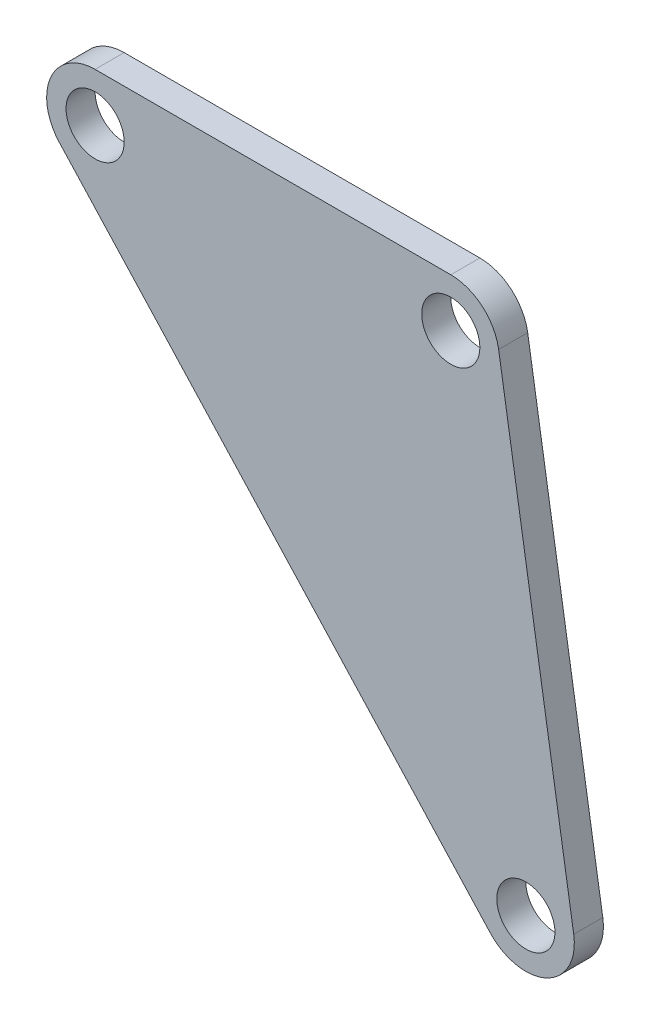
ISO-10303-21;
HEADER;
FILE_DESCRIPTION(('STEP AP214'),'2;1');
FILE_NAME('part.step','',(''),(''),'','','');
FILE_SCHEMA(('AUTOMOTIVE_DESIGN { 1 0 10303 214 1 1 1 1 }'));
ENDSEC;
DATA;
#1=APPLICATION_CONTEXT('core data for automotive mechanical design processes');
#2=APPLICATION_PROTOCOL_DEFINITION('international standard','automotive_design',2000,#1);
#3=PRODUCT_CONTEXT('',#1,'mechanical');
#4=PRODUCT('Part','Part','',(#3));
#5=PRODUCT_RELATED_PRODUCT_CATEGORY('part','',(#4));
#6=PRODUCT_DEFINITION_FORMATION('','',#4);
#7=PRODUCT_DEFINITION_CONTEXT('part definition',#1,'design');
#8=PRODUCT_DEFINITION('design','',#6,#7);
#9=PRODUCT_DEFINITION_SHAPE('','',#8);
#10=(LENGTH_UNIT() NAMED_UNIT(*) SI_UNIT(.MILLI.,.METRE.));
#11=(NAMED_UNIT(*) PLANE_ANGLE_UNIT() SI_UNIT($,.RADIAN.));
#12=(NAMED_UNIT(*) SI_UNIT($,.STERADIAN.) SOLID_ANGLE_UNIT());
#13=UNCERTAINTY_MEASURE_WITH_UNIT(LENGTH_MEASURE(1.E-05),#10,'distance_accuracy_value','');
#14=(GEOMETRIC_REPRESENTATION_CONTEXT(3) GLOBAL_UNCERTAINTY_ASSIGNED_CONTEXT((#13)) GLOBAL_UNIT_ASSIGNED_CONTEXT((#10,
#11,#12)) REPRESENTATION_CONTEXT('',''));
#15=CARTESIAN_POINT('',(0.,0.,0.));
#16=DIRECTION('',(0.,0.,1.));
#17=DIRECTION('',(1.,0.,0.));
#18=AXIS2_PLACEMENT_3D('',#15,#16,#17);
#19=CARTESIAN_POINT('',(0.,0.,3.));
#20=DIRECTION('',(0.,0.,-1.));
#21=DIRECTION('',(-1.,0.,0.));
#22=AXIS2_PLACEMENT_3D('',#19,#20,#21);
#23=PLANE('',#22);
#24=DIRECTION('',(0.67650828014383,-0.736435025577164,0.));
#25=VECTOR('',#24,1.);
#26=CARTESIAN_POINT('',(-48.0825946751372,4.99999999999999,3.));
#27=LINE('',#26,#25);
#28=CARTESIAN_POINT('',(-40.3821751278858,-3.38254140071916,3.));
#29=VERTEX_POINT('',#28);
#30=CARTESIAN_POINT('',(4.06441887756376,-51.7663225811388,3.));
#31=VERTEX_POINT('',#30);
#32=EDGE_CURVE('E114',#29,#31,#27,.T.);
#33=ORIENTED_EDGE('',*,*,#32,.T.);
#34=CARTESIAN_POINT('',(7.74659400544958,-48.3837811804196,3.));
#35=DIRECTION('',(0.,0.,-1.));
#36=DIRECTION('',(-1.,0.,0.));
#37=AXIS2_PLACEMENT_3D('',#34,#35,#36);
#38=CIRCLE('',#37,5.);
#39=CARTESIAN_POINT('',(12.6837145340638,-47.5933124043533,3.));
#40=VERTEX_POINT('',#39);
#41=EDGE_CURVE('E129',#31,#40,#38,.F.);
#42=ORIENTED_EDGE('',*,*,#41,.T.);
#43=DIRECTION('',(-0.158093755213257,0.98742410572285,0.));
#44=VECTOR('',#43,1.);
#45=CARTESIAN_POINT('',(15.3122227106276,-64.0104841776948,3.));
#46=LINE('',#45,#44);
#47=CARTESIAN_POINT('',(4.93712052861423,0.790468776066297,3.));
#48=VERTEX_POINT('',#47);
#49=EDGE_CURVE('E104',#40,#48,#46,.T.);
#50=ORIENTED_EDGE('',*,*,#49,.T.);
#51=CARTESIAN_POINT('',(0.,0.,3.));
#52=DIRECTION('',(0.,0.,-1.));
#53=DIRECTION('',(-1.,0.,0.));
#54=AXIS2_PLACEMENT_3D('',#51,#52,#53);
#55=CIRCLE('',#54,5.);
#56=CARTESIAN_POINT('',(0.,5.,3.));
#57=VERTEX_POINT('',#56);
#58=EDGE_CURVE('E52',#48,#57,#55,.F.);
#59=ORIENTED_EDGE('',*,*,#58,.T.);
#60=DIRECTION('',(-1.,0.,0.));
#61=VECTOR('',#60,1.);
#62=CARTESIAN_POINT('',(4.26314407308507,5.,3.));
#63=LINE('',#62,#61);
#64=CARTESIAN_POINT('',(-36.7,4.99999999999999,3.));
#65=VERTEX_POINT('',#64);
#66=EDGE_CURVE('E111',#57,#65,#63,.T.);
#67=ORIENTED_EDGE('',*,*,#66,.T.);
#68=CARTESIAN_POINT('',(-36.7,0.,3.));
#69=DIRECTION('',(0.,0.,-1.));
#70=DIRECTION('',(-1.,0.,0.));
#71=AXIS2_PLACEMENT_3D('',#68,#69,#70);
#72=CIRCLE('',#71,5.);
#73=EDGE_CURVE('E127',#65,#29,#72,.F.);
#74=ORIENTED_EDGE('',*,*,#73,.T.);
#75=EDGE_LOOP('',(#33,#42,#50,#59,#67,#74));
#76=FACE_BOUND('',#75,.T.);
#77=CARTESIAN_POINT('',(-36.7,0.,3.));
#78=DIRECTION('',(0.,0.,1.));
#79=DIRECTION('',(1.,0.,0.));
#80=AXIS2_PLACEMENT_3D('',#77,#78,#79);
#81=CIRCLE('',#80,3.00000000000001);
#82=CARTESIAN_POINT('',(-33.7,0.,3.));
#83=VERTEX_POINT('',#82);
#84=EDGE_CURVE('E134',#83,#83,#81,.T.);
#85=ORIENTED_EDGE('',*,*,#84,.F.);
#86=EDGE_LOOP('',(#85));
#87=FACE_BOUND('',#86,.T.);
#88=CARTESIAN_POINT('',(0.,0.,3.));
#89=DIRECTION('',(0.,0.,1.));
#90=DIRECTION('',(1.,0.,0.));
#91=AXIS2_PLACEMENT_3D('',#88,#89,#90);
#92=CIRCLE('',#91,3.);
#93=CARTESIAN_POINT('',(3.,0.,3.));
#94=VERTEX_POINT('',#93);
#95=EDGE_CURVE('E143',#94,#94,#92,.T.);
#96=ORIENTED_EDGE('',*,*,#95,.F.);
#97=EDGE_LOOP('',(#96));
#98=FACE_BOUND('',#97,.T.);
#99=CARTESIAN_POINT('',(7.74659400544959,-48.3837811804197,3.));
#100=DIRECTION('',(0.,0.,1.));
#101=DIRECTION('',(1.,0.,0.));
#102=AXIS2_PLACEMENT_3D('',#99,#100,#101);
#103=CIRCLE('',#102,3.);
#104=CARTESIAN_POINT('',(10.7465940054496,-48.3837811804197,3.));
#105=VERTEX_POINT('',#104);
#106=EDGE_CURVE('E148',#105,#105,#103,.T.);
#107=ORIENTED_EDGE('',*,*,#106,.F.);
#108=EDGE_LOOP('',(#107));
#109=FACE_BOUND('',#108,.T.);
#110=ADVANCED_FACE('F32',(#76,#87,#98,#109),#23,.F.);
#111=CARTESIAN_POINT('',(0.,0.,0.));
#112=DIRECTION('',(0.,0.,-1.));
#113=DIRECTION('',(-1.,0.,0.));
#114=AXIS2_PLACEMENT_3D('',#111,#112,#113);
#115=PLANE('',#114);
#116=CARTESIAN_POINT('',(0.,0.,0.));
#117=DIRECTION('',(0.,0.,1.));
#118=DIRECTION('',(1.,0.,0.));
#119=AXIS2_PLACEMENT_3D('',#116,#117,#118);
#120=CIRCLE('',#119,3.);
#121=CARTESIAN_POINT('',(3.,0.,0.));
#122=VERTEX_POINT('',#121);
#123=EDGE_CURVE('E145',#122,#122,#120,.T.);
#124=ORIENTED_EDGE('',*,*,#123,.T.);
#125=EDGE_LOOP('',(#124));
#126=FACE_BOUND('',#125,.T.);
#127=DIRECTION('',(-0.158093755213257,0.98742410572285,0.));
#128=VECTOR('',#127,1.);
#129=CARTESIAN_POINT('',(15.3122227106276,-64.0104841776948,0.));
#130=LINE('',#129,#128);
#131=CARTESIAN_POINT('',(12.6837145340638,-47.5933124043533,0.));
#132=VERTEX_POINT('',#131);
#133=CARTESIAN_POINT('',(4.93712052861423,0.790468776066297,0.));
#134=VERTEX_POINT('',#133);
#135=EDGE_CURVE('E102',#132,#134,#130,.T.);
#136=ORIENTED_EDGE('',*,*,#135,.F.);
#137=CARTESIAN_POINT('',(7.74659400544958,-48.3837811804196,0.));
#138=DIRECTION('',(0.,0.,-1.));
#139=DIRECTION('',(-1.,0.,0.));
#140=AXIS2_PLACEMENT_3D('',#137,#138,#139);
#141=CIRCLE('',#140,5.);
#142=CARTESIAN_POINT('',(4.06441887756376,-51.7663225811388,0.));
#143=VERTEX_POINT('',#142);
#144=EDGE_CURVE('E85',#132,#143,#141,.T.);
#145=ORIENTED_EDGE('',*,*,#144,.T.);
#146=DIRECTION('',(0.67650828014383,-0.736435025577164,0.));
#147=VECTOR('',#146,1.);
#148=CARTESIAN_POINT('',(-48.0825946751372,4.99999999999999,0.));
#149=LINE('',#148,#147);
#150=CARTESIAN_POINT('',(-40.3821751278858,-3.38254140071916,0.));
#151=VERTEX_POINT('',#150);
#152=EDGE_CURVE('E112',#151,#143,#149,.T.);
#153=ORIENTED_EDGE('',*,*,#152,.F.);
#154=CARTESIAN_POINT('',(-36.7,0.,0.));
#155=DIRECTION('',(0.,0.,-1.));
#156=DIRECTION('',(-1.,0.,0.));
#157=AXIS2_PLACEMENT_3D('',#154,#155,#156);
#158=CIRCLE('',#157,5.);
#159=CARTESIAN_POINT('',(-36.7,4.99999999999999,0.));
#160=VERTEX_POINT('',#159);
#161=EDGE_CURVE('E96',#151,#160,#158,.T.);
#162=ORIENTED_EDGE('',*,*,#161,.T.);
#163=DIRECTION('',(-1.,0.,0.));
#164=VECTOR('',#163,1.);
#165=CARTESIAN_POINT('',(4.26314407308507,5.,0.));
#166=LINE('',#165,#164);
#167=CARTESIAN_POINT('',(0.,5.,0.));
#168=VERTEX_POINT('',#167);
#169=EDGE_CURVE('E116',#168,#160,#166,.T.);
#170=ORIENTED_EDGE('',*,*,#169,.F.);
#171=CARTESIAN_POINT('',(0.,0.,0.));
#172=DIRECTION('',(0.,0.,-1.));
#173=DIRECTION('',(-1.,0.,0.));
#174=AXIS2_PLACEMENT_3D('',#171,#172,#173);
#175=CIRCLE('',#174,5.);
#176=EDGE_CURVE('E105',#168,#134,#175,.T.);
#177=ORIENTED_EDGE('',*,*,#176,.T.);
#178=EDGE_LOOP('',(#136,#145,#153,#162,#170,#177));
#179=FACE_BOUND('',#178,.T.);
#180=CARTESIAN_POINT('',(-36.7,0.,0.));
#181=DIRECTION('',(0.,0.,1.));
#182=DIRECTION('',(1.,0.,0.));
#183=AXIS2_PLACEMENT_3D('',#180,#181,#182);
#184=CIRCLE('',#183,3.00000000000001);
#185=CARTESIAN_POINT('',(-33.7,0.,0.));
#186=VERTEX_POINT('',#185);
#187=EDGE_CURVE('E136',#186,#186,#184,.T.);
#188=ORIENTED_EDGE('',*,*,#187,.T.);
#189=EDGE_LOOP('',(#188));
#190=FACE_BOUND('',#189,.T.);
#191=CARTESIAN_POINT('',(7.74659400544959,-48.3837811804197,0.));
#192=DIRECTION('',(0.,0.,1.));
#193=DIRECTION('',(1.,0.,0.));
#194=AXIS2_PLACEMENT_3D('',#191,#192,#193);
#195=CIRCLE('',#194,3.);
#196=CARTESIAN_POINT('',(10.7465940054496,-48.3837811804197,0.));
#197=VERTEX_POINT('',#196);
#198=EDGE_CURVE('E151',#197,#197,#195,.T.);
#199=ORIENTED_EDGE('',*,*,#198,.T.);
#200=EDGE_LOOP('',(#199));
#201=FACE_BOUND('',#200,.T.);
#202=ADVANCED_FACE('F108',(#126,#179,#190,#201),#115,.T.);
#203=CARTESIAN_POINT('',(4.26314407308507,5.,3.));
#204=DIRECTION('',(0.,-1.,0.));
#205=DIRECTION('',(1.,0.,0.));
#206=AXIS2_PLACEMENT_3D('',#203,#204,#205);
#207=PLANE('',#206);
#208=ORIENTED_EDGE('',*,*,#169,.T.);
#209=DIRECTION('',(0.,0.,-1.));
#210=VECTOR('',#209,1.);
#211=CARTESIAN_POINT('',(-36.7,4.99999999999999,3.));
#212=LINE('',#211,#210);
#213=EDGE_CURVE('E11',#160,#65,#212,.F.);
#214=ORIENTED_EDGE('',*,*,#213,.T.);
#215=ORIENTED_EDGE('',*,*,#66,.F.);
#216=DIRECTION('',(0.,0.,-1.));
#217=VECTOR('',#216,1.);
#218=CARTESIAN_POINT('',(0.,5.,3.));
#219=LINE('',#218,#217);
#220=EDGE_CURVE('E40',#57,#168,#219,.T.);
#221=ORIENTED_EDGE('',*,*,#220,.T.);
#222=EDGE_LOOP('',(#208,#214,#215,#221));
#223=FACE_BOUND('',#222,.T.);
#224=ADVANCED_FACE('F132',(#223),#207,.F.);
#225=CARTESIAN_POINT('',(-48.0825946751372,4.99999999999999,3.));
#226=DIRECTION('',(0.736435025577164,0.67650828014383,0.));
#227=DIRECTION('',(-0.67650828014383,0.736435025577164,0.));
#228=AXIS2_PLACEMENT_3D('',#225,#226,#227);
#229=PLANE('',#228);
#230=ORIENTED_EDGE('',*,*,#152,.T.);
#231=DIRECTION('',(0.,0.,-1.));
#232=VECTOR('',#231,1.);
#233=CARTESIAN_POINT('',(4.06441887756376,-51.7663225811388,3.));
#234=LINE('',#233,#232);
#235=EDGE_CURVE('E90',#143,#31,#234,.F.);
#236=ORIENTED_EDGE('',*,*,#235,.T.);
#237=ORIENTED_EDGE('',*,*,#32,.F.);
#238=DIRECTION('',(0.,0.,-1.));
#239=VECTOR('',#238,1.);
#240=CARTESIAN_POINT('',(-40.3821751278858,-3.38254140071915,3.));
#241=LINE('',#240,#239);
#242=EDGE_CURVE('E95',#29,#151,#241,.T.);
#243=ORIENTED_EDGE('',*,*,#242,.T.);
#244=EDGE_LOOP('',(#230,#236,#237,#243));
#245=FACE_BOUND('',#244,.T.);
#246=ADVANCED_FACE('F174',(#245),#229,.F.);
#247=CARTESIAN_POINT('',(15.3122227106276,-64.0104841776948,3.));
#248=DIRECTION('',(-0.98742410572285,-0.158093755213257,0.));
#249=DIRECTION('',(0.158093755213257,-0.98742410572285,0.));
#250=AXIS2_PLACEMENT_3D('',#247,#248,#249);
#251=PLANE('',#250);
#252=ORIENTED_EDGE('',*,*,#49,.F.);
#253=DIRECTION('',(0.,0.,-1.));
#254=VECTOR('',#253,1.);
#255=CARTESIAN_POINT('',(12.6837145340638,-47.5933124043533,3.));
#256=LINE('',#255,#254);
#257=EDGE_CURVE('E89',#40,#132,#256,.T.);
#258=ORIENTED_EDGE('',*,*,#257,.T.);
#259=ORIENTED_EDGE('',*,*,#135,.T.);
#260=DIRECTION('',(0.,0.,-1.));
#261=VECTOR('',#260,1.);
#262=CARTESIAN_POINT('',(4.93712052861424,0.790468776066283,3.));
#263=LINE('',#262,#261);
#264=EDGE_CURVE('E106',#134,#48,#263,.F.);
#265=ORIENTED_EDGE('',*,*,#264,.T.);
#266=EDGE_LOOP('',(#252,#258,#259,#265));
#267=FACE_BOUND('',#266,.T.);
#268=ADVANCED_FACE('F101',(#267),#251,.F.);
#269=CARTESIAN_POINT('',(-36.7,0.,3.));
#270=DIRECTION('',(0.,0.,-1.));
#271=DIRECTION('',(-1.,0.,0.));
#272=AXIS2_PLACEMENT_3D('',#269,#270,#271);
#273=CYLINDRICAL_SURFACE('',#272,3.00000000000001);
#274=ORIENTED_EDGE('',*,*,#84,.T.);
#275=EDGE_LOOP('',(#274));
#276=FACE_BOUND('',#275,.T.);
#277=ORIENTED_EDGE('',*,*,#187,.F.);
#278=EDGE_LOOP('',(#277));
#279=FACE_BOUND('',#278,.T.);
#280=ADVANCED_FACE('F169',(#276,#279),#273,.F.);
#281=CARTESIAN_POINT('',(0.,0.,3.));
#282=DIRECTION('',(0.,0.,-1.));
#283=DIRECTION('',(-1.,0.,0.));
#284=AXIS2_PLACEMENT_3D('',#281,#282,#283);
#285=CYLINDRICAL_SURFACE('',#284,3.);
#286=ORIENTED_EDGE('',*,*,#95,.T.);
#287=EDGE_LOOP('',(#286));
#288=FACE_BOUND('',#287,.T.);
#289=ORIENTED_EDGE('',*,*,#123,.F.);
#290=EDGE_LOOP('',(#289));
#291=FACE_BOUND('',#290,.T.);
#292=ADVANCED_FACE('F241',(#288,#291),#285,.F.);
#293=CARTESIAN_POINT('',(7.74659400544959,-48.3837811804197,3.));
#294=DIRECTION('',(0.,0.,-1.));
#295=DIRECTION('',(-1.,0.,0.));
#296=AXIS2_PLACEMENT_3D('',#293,#294,#295);
#297=CYLINDRICAL_SURFACE('',#296,3.);
#298=ORIENTED_EDGE('',*,*,#106,.T.);
#299=EDGE_LOOP('',(#298));
#300=FACE_BOUND('',#299,.T.);
#301=ORIENTED_EDGE('',*,*,#198,.F.);
#302=EDGE_LOOP('',(#301));
#303=FACE_BOUND('',#302,.T.);
#304=ADVANCED_FACE('F157',(#300,#303),#297,.F.);
#305=CARTESIAN_POINT('',(7.74659400544958,-48.3837811804196,3.));
#306=DIRECTION('',(0.,0.,-1.));
#307=DIRECTION('',(-1.,0.,0.));
#308=AXIS2_PLACEMENT_3D('',#305,#306,#307);
#309=CYLINDRICAL_SURFACE('',#308,5.);
#310=ORIENTED_EDGE('',*,*,#41,.F.);
#311=ORIENTED_EDGE('',*,*,#235,.F.);
#312=ORIENTED_EDGE('',*,*,#144,.F.);
#313=ORIENTED_EDGE('',*,*,#257,.F.);
#314=EDGE_LOOP('',(#310,#311,#312,#313));
#315=FACE_BOUND('',#314,.T.);
#316=ADVANCED_FACE('F88',(#315),#309,.T.);
#317=CARTESIAN_POINT('',(-36.7,0.,3.));
#318=DIRECTION('',(0.,0.,-1.));
#319=DIRECTION('',(-1.,0.,0.));
#320=AXIS2_PLACEMENT_3D('',#317,#318,#319);
#321=CYLINDRICAL_SURFACE('',#320,5.);
#322=ORIENTED_EDGE('',*,*,#73,.F.);
#323=ORIENTED_EDGE('',*,*,#213,.F.);
#324=ORIENTED_EDGE('',*,*,#161,.F.);
#325=ORIENTED_EDGE('',*,*,#242,.F.);
#326=EDGE_LOOP('',(#322,#323,#324,#325));
#327=FACE_BOUND('',#326,.T.);
#328=ADVANCED_FACE('F181',(#327),#321,.T.);
#329=CARTESIAN_POINT('',(0.,0.,3.));
#330=DIRECTION('',(0.,0.,-1.));
#331=DIRECTION('',(-1.,0.,0.));
#332=AXIS2_PLACEMENT_3D('',#329,#330,#331);
#333=CYLINDRICAL_SURFACE('',#332,5.);
#334=ORIENTED_EDGE('',*,*,#58,.F.);
#335=ORIENTED_EDGE('',*,*,#264,.F.);
#336=ORIENTED_EDGE('',*,*,#176,.F.);
#337=ORIENTED_EDGE('',*,*,#220,.F.);
#338=EDGE_LOOP('',(#334,#335,#336,#337));
#339=FACE_BOUND('',#338,.T.);
#340=ADVANCED_FACE('F34',(#339),#333,.T.);
#341=CLOSED_SHELL('',(#110,#202,#224,#246,#268,#280,#292,#304,#316,#328,#340));
#342=MANIFOLD_SOLID_BREP('B2',#341);
#343=ADVANCED_BREP_SHAPE_REPRESENTATION('',(#18,#342),#14);
#344=SHAPE_DEFINITION_REPRESENTATION(#9,#343);
ENDSEC;
END-ISO-10303-21;
